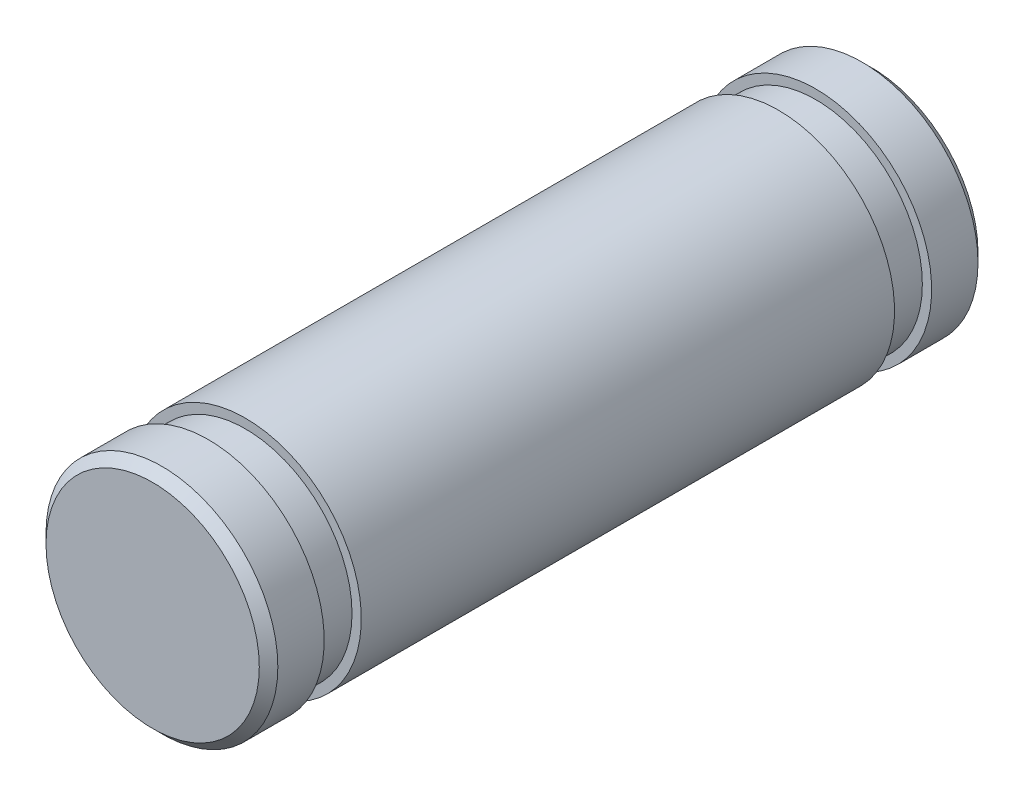
ISO-10303-21;
HEADER;
FILE_DESCRIPTION(('STEP AP214'),'2;1');
FILE_NAME('part.step','',(''),(''),'','','');
FILE_SCHEMA(('AUTOMOTIVE_DESIGN { 1 0 10303 214 1 1 1 1 }'));
ENDSEC;
DATA;
#1=APPLICATION_CONTEXT('core data for automotive mechanical design processes');
#2=APPLICATION_PROTOCOL_DEFINITION('international standard','automotive_design',2000,#1);
#3=PRODUCT_CONTEXT('',#1,'mechanical');
#4=PRODUCT('Part','Part','',(#3));
#5=PRODUCT_RELATED_PRODUCT_CATEGORY('part','',(#4));
#6=PRODUCT_DEFINITION_FORMATION('','',#4);
#7=PRODUCT_DEFINITION_CONTEXT('part definition',#1,'design');
#8=PRODUCT_DEFINITION('design','',#6,#7);
#9=PRODUCT_DEFINITION_SHAPE('','',#8);
#10=(LENGTH_UNIT() NAMED_UNIT(*) SI_UNIT(.MILLI.,.METRE.));
#11=(NAMED_UNIT(*) PLANE_ANGLE_UNIT() SI_UNIT($,.RADIAN.));
#12=(NAMED_UNIT(*) SI_UNIT($,.STERADIAN.) SOLID_ANGLE_UNIT());
#13=UNCERTAINTY_MEASURE_WITH_UNIT(LENGTH_MEASURE(1.E-05),#10,'distance_accuracy_value','');
#14=(GEOMETRIC_REPRESENTATION_CONTEXT(3) GLOBAL_UNCERTAINTY_ASSIGNED_CONTEXT((#13)) GLOBAL_UNIT_ASSIGNED_CONTEXT((#10,
#11,#12)) REPRESENTATION_CONTEXT('',''));
#15=CARTESIAN_POINT('',(0.,0.,0.));
#16=DIRECTION('',(0.,0.,1.));
#17=DIRECTION('',(1.,0.,0.));
#18=AXIS2_PLACEMENT_3D('',#15,#16,#17);
#19=CARTESIAN_POINT('',(0.,0.,13.5));
#20=DIRECTION('',(0.,0.,1.));
#21=DIRECTION('',(1.,0.,0.));
#22=AXIS2_PLACEMENT_3D('',#19,#20,#21);
#23=PLANE('',#22);
#24=CARTESIAN_POINT('',(0.,0.,13.5));
#25=DIRECTION('',(0.,0.,-1.));
#26=DIRECTION('',(-1.,0.,0.));
#27=AXIS2_PLACEMENT_3D('',#24,#25,#26);
#28=CIRCLE('',#27,2.3);
#29=CARTESIAN_POINT('',(2.3,0.,13.5));
#30=VERTEX_POINT('',#29);
#31=EDGE_CURVE('E145',#30,#30,#28,.T.);
#32=ORIENTED_EDGE('',*,*,#31,.T.);
#33=EDGE_LOOP('',(#32));
#34=FACE_BOUND('',#33,.T.);
#35=CARTESIAN_POINT('',(0.,0.,13.5));
#36=DIRECTION('',(0.,0.,-1.));
#37=DIRECTION('',(1.,0.,0.));
#38=AXIS2_PLACEMENT_3D('',#35,#36,#37);
#39=CIRCLE('',#38,2.5);
#40=CARTESIAN_POINT('',(-2.5,0.,13.5));
#41=VERTEX_POINT('',#40);
#42=EDGE_CURVE('E141',#41,#41,#39,.T.);
#43=ORIENTED_EDGE('',*,*,#42,.F.);
#44=EDGE_LOOP('',(#43));
#45=FACE_BOUND('',#44,.T.);
#46=ADVANCED_FACE('F17',(#34,#45),#23,.T.);
#47=CARTESIAN_POINT('',(0.,0.,14.3));
#48=DIRECTION('',(0.,0.,1.));
#49=DIRECTION('',(1.,0.,0.));
#50=AXIS2_PLACEMENT_3D('',#47,#48,#49);
#51=PLANE('',#50);
#52=CARTESIAN_POINT('',(0.,0.,14.3));
#53=DIRECTION('',(0.,0.,-1.));
#54=DIRECTION('',(-1.,0.,0.));
#55=AXIS2_PLACEMENT_3D('',#52,#53,#54);
#56=CIRCLE('',#55,2.3);
#57=CARTESIAN_POINT('',(2.3,0.,14.3));
#58=VERTEX_POINT('',#57);
#59=EDGE_CURVE('E11',#58,#58,#56,.T.);
#60=ORIENTED_EDGE('',*,*,#59,.F.);
#61=EDGE_LOOP('',(#60));
#62=FACE_BOUND('',#61,.T.);
#63=CARTESIAN_POINT('',(0.,0.,14.3));
#64=DIRECTION('',(0.,0.,1.));
#65=DIRECTION('',(1.,0.,0.));
#66=AXIS2_PLACEMENT_3D('',#63,#64,#65);
#67=CIRCLE('',#66,2.5);
#68=CARTESIAN_POINT('',(-2.5,0.,14.3));
#69=VERTEX_POINT('',#68);
#70=EDGE_CURVE('E130',#69,#69,#67,.T.);
#71=ORIENTED_EDGE('',*,*,#70,.F.);
#72=EDGE_LOOP('',(#71));
#73=FACE_BOUND('',#72,.T.);
#74=ADVANCED_FACE('F190',(#62,#73),#51,.F.);
#75=CARTESIAN_POINT('',(0.,0.,13.5));
#76=DIRECTION('',(0.,0.,1.));
#77=DIRECTION('',(-1.,0.,0.));
#78=AXIS2_PLACEMENT_3D('',#75,#76,#77);
#79=CYLINDRICAL_SURFACE('',#78,2.3);
#80=ORIENTED_EDGE('',*,*,#31,.F.);
#81=DIRECTION('',(0.,0.,1.));
#82=VECTOR('',#81,1.);
#83=CARTESIAN_POINT('',(2.3,0.,13.5));
#84=LINE('',#83,#82);
#85=EDGE_CURVE('E26',#30,#58,#84,.T.);
#86=ORIENTED_EDGE('',*,*,#85,.T.);
#87=ORIENTED_EDGE('',*,*,#59,.T.);
#88=ORIENTED_EDGE('',*,*,#85,.F.);
#89=EDGE_LOOP('',(#80,#86,#87,#88));
#90=FACE_BOUND('',#89,.T.);
#91=ADVANCED_FACE('F195',(#90),#79,.T.);
#92=CARTESIAN_POINT('',(0.,0.,0.));
#93=DIRECTION('',(0.,0.,1.));
#94=DIRECTION('',(1.,0.,0.));
#95=AXIS2_PLACEMENT_3D('',#92,#93,#94);
#96=CYLINDRICAL_SURFACE('',#95,2.5);
#97=ORIENTED_EDGE('',*,*,#42,.T.);
#98=DIRECTION('',(0.,0.,-1.));
#99=VECTOR('',#98,1.);
#100=CARTESIAN_POINT('',(-2.5,0.,0.));
#101=LINE('',#100,#99);
#102=CARTESIAN_POINT('',(-2.5,0.,2.));
#103=VERTEX_POINT('',#102);
#104=EDGE_CURVE('E144',#41,#103,#101,.T.);
#105=ORIENTED_EDGE('',*,*,#104,.T.);
#106=CARTESIAN_POINT('',(0.,0.,2.));
#107=DIRECTION('',(0.,0.,1.));
#108=DIRECTION('',(1.,0.,0.));
#109=AXIS2_PLACEMENT_3D('',#106,#107,#108);
#110=CIRCLE('',#109,2.5);
#111=EDGE_CURVE('E137',#103,#103,#110,.T.);
#112=ORIENTED_EDGE('',*,*,#111,.T.);
#113=ORIENTED_EDGE('',*,*,#104,.F.);
#114=EDGE_LOOP('',(#97,#105,#112,#113));
#115=FACE_BOUND('',#114,.T.);
#116=ADVANCED_FACE('F200',(#115),#96,.T.);
#117=CARTESIAN_POINT('',(0.,0.,2.));
#118=DIRECTION('',(0.,0.,-1.));
#119=DIRECTION('',(0.,-1.,0.));
#120=AXIS2_PLACEMENT_3D('',#117,#118,#119);
#121=PLANE('',#120);
#122=CARTESIAN_POINT('',(0.,0.,2.));
#123=DIRECTION('',(0.,0.,1.));
#124=DIRECTION('',(1.,0.,0.));
#125=AXIS2_PLACEMENT_3D('',#122,#123,#124);
#126=CIRCLE('',#125,2.3);
#127=CARTESIAN_POINT('',(-2.3,0.,2.));
#128=VERTEX_POINT('',#127);
#129=EDGE_CURVE('E125',#128,#128,#126,.T.);
#130=ORIENTED_EDGE('',*,*,#129,.T.);
#131=EDGE_LOOP('',(#130));
#132=FACE_BOUND('',#131,.T.);
#133=ORIENTED_EDGE('',*,*,#111,.F.);
#134=EDGE_LOOP('',(#133));
#135=FACE_BOUND('',#134,.T.);
#136=ADVANCED_FACE('F203',(#132,#135),#121,.T.);
#137=CARTESIAN_POINT('',(0.,0.,1.2));
#138=DIRECTION('',(0.,0.,-1.));
#139=DIRECTION('',(0.,-1.,0.));
#140=AXIS2_PLACEMENT_3D('',#137,#138,#139);
#141=PLANE('',#140);
#142=CARTESIAN_POINT('',(0.,0.,1.2));
#143=DIRECTION('',(0.,0.,1.));
#144=DIRECTION('',(1.,0.,0.));
#145=AXIS2_PLACEMENT_3D('',#142,#143,#144);
#146=CIRCLE('',#145,2.3);
#147=CARTESIAN_POINT('',(-2.3,0.,1.2));
#148=VERTEX_POINT('',#147);
#149=EDGE_CURVE('E134',#148,#148,#146,.T.);
#150=ORIENTED_EDGE('',*,*,#149,.F.);
#151=EDGE_LOOP('',(#150));
#152=FACE_BOUND('',#151,.T.);
#153=CARTESIAN_POINT('',(0.,0.,1.2));
#154=DIRECTION('',(0.,0.,-1.));
#155=DIRECTION('',(1.,0.,0.));
#156=AXIS2_PLACEMENT_3D('',#153,#154,#155);
#157=CIRCLE('',#156,2.5);
#158=CARTESIAN_POINT('',(-2.5,0.,1.2));
#159=VERTEX_POINT('',#158);
#160=EDGE_CURVE('E95',#159,#159,#157,.T.);
#161=ORIENTED_EDGE('',*,*,#160,.F.);
#162=EDGE_LOOP('',(#161));
#163=FACE_BOUND('',#162,.T.);
#164=ADVANCED_FACE('F186',(#152,#163),#141,.F.);
#165=CARTESIAN_POINT('',(0.,0.,2.));
#166=DIRECTION('',(0.,0.,-1.));
#167=DIRECTION('',(1.,0.,0.));
#168=AXIS2_PLACEMENT_3D('',#165,#166,#167);
#169=CYLINDRICAL_SURFACE('',#168,2.3);
#170=ORIENTED_EDGE('',*,*,#129,.F.);
#171=DIRECTION('',(0.,0.,-1.));
#172=VECTOR('',#171,1.);
#173=CARTESIAN_POINT('',(-2.3,0.,2.));
#174=LINE('',#173,#172);
#175=EDGE_CURVE('E129',#128,#148,#174,.T.);
#176=ORIENTED_EDGE('',*,*,#175,.T.);
#177=ORIENTED_EDGE('',*,*,#149,.T.);
#178=ORIENTED_EDGE('',*,*,#175,.F.);
#179=EDGE_LOOP('',(#170,#176,#177,#178));
#180=FACE_BOUND('',#179,.T.);
#181=ADVANCED_FACE('F176',(#180),#169,.T.);
#182=CARTESIAN_POINT('',(0.,0.,15.5));
#183=DIRECTION('',(0.,0.,1.));
#184=DIRECTION('',(1.,0.,0.));
#185=AXIS2_PLACEMENT_3D('',#182,#183,#184);
#186=PLANE('',#185);
#187=CARTESIAN_POINT('',(0.,0.,15.5));
#188=DIRECTION('',(0.,0.,-1.));
#189=DIRECTION('',(-1.,0.,0.));
#190=AXIS2_PLACEMENT_3D('',#187,#188,#189);
#191=CIRCLE('',#190,2.3);
#192=CARTESIAN_POINT('',(2.3,0.,15.5));
#193=VERTEX_POINT('',#192);
#194=EDGE_CURVE('E113',#193,#193,#191,.T.);
#195=ORIENTED_EDGE('',*,*,#194,.F.);
#196=EDGE_LOOP('',(#195));
#197=FACE_BOUND('',#196,.T.);
#198=ADVANCED_FACE('F173',(#197),#186,.T.);
#199=CARTESIAN_POINT('',(0.,0.,0.));
#200=DIRECTION('',(0.,0.,1.));
#201=DIRECTION('',(1.,0.,0.));
#202=AXIS2_PLACEMENT_3D('',#199,#200,#201);
#203=CYLINDRICAL_SURFACE('',#202,2.5);
#204=CARTESIAN_POINT('',(0.,0.,15.3));
#205=DIRECTION('',(0.,0.,1.));
#206=DIRECTION('',(-1.,0.,0.));
#207=AXIS2_PLACEMENT_3D('',#204,#205,#206);
#208=CIRCLE('',#207,2.5);
#209=CARTESIAN_POINT('',(2.5,0.,15.3));
#210=VERTEX_POINT('',#209);
#211=CARTESIAN_POINT('',(-2.5,0.,15.3));
#212=VERTEX_POINT('',#211);
#213=EDGE_CURVE('E117',#210,#212,#208,.T.);
#214=ORIENTED_EDGE('',*,*,#213,.F.);
#215=CARTESIAN_POINT('',(0.,0.,15.3));
#216=DIRECTION('',(0.,0.,1.));
#217=DIRECTION('',(-1.,0.,0.));
#218=AXIS2_PLACEMENT_3D('',#215,#216,#217);
#219=CIRCLE('',#218,2.5);
#220=EDGE_CURVE('E114',#212,#210,#219,.T.);
#221=ORIENTED_EDGE('',*,*,#220,.F.);
#222=DIRECTION('',(0.,0.,-1.));
#223=VECTOR('',#222,1.);
#224=CARTESIAN_POINT('',(-2.5,0.,0.));
#225=LINE('',#224,#223);
#226=EDGE_CURVE('E108',#212,#69,#225,.T.);
#227=ORIENTED_EDGE('',*,*,#226,.T.);
#228=ORIENTED_EDGE('',*,*,#70,.T.);
#229=ORIENTED_EDGE('',*,*,#226,.F.);
#230=EDGE_LOOP('',(#214,#221,#227,#228,#229));
#231=FACE_BOUND('',#230,.T.);
#232=ADVANCED_FACE('F175',(#231),#203,.T.);
#233=CARTESIAN_POINT('',(0.,0.,15.4));
#234=DIRECTION('',(0.,0.,-1.));
#235=DIRECTION('',(-1.,0.,0.));
#236=AXIS2_PLACEMENT_3D('',#233,#234,#235);
#237=CONICAL_SURFACE('',#236,2.4,0.785398163397448);
#238=ORIENTED_EDGE('',*,*,#194,.T.);
#239=DIRECTION('',(0.707106781186548,0.,-0.707106781186548));
#240=VECTOR('',#239,1.);
#241=CARTESIAN_POINT('',(2.4,0.,15.4));
#242=LINE('',#241,#240);
#243=EDGE_CURVE('E118',#193,#210,#242,.T.);
#244=ORIENTED_EDGE('',*,*,#243,.T.);
#245=ORIENTED_EDGE('',*,*,#213,.T.);
#246=ORIENTED_EDGE('',*,*,#220,.T.);
#247=ORIENTED_EDGE('',*,*,#243,.F.);
#248=EDGE_LOOP('',(#238,#244,#245,#246,#247));
#249=FACE_BOUND('',#248,.T.);
#250=ADVANCED_FACE('F171',(#249),#237,.T.);
#251=CARTESIAN_POINT('',(0.,0.,0.));
#252=DIRECTION('',(0.,0.,1.));
#253=DIRECTION('',(1.,0.,0.));
#254=AXIS2_PLACEMENT_3D('',#251,#252,#253);
#255=PLANE('',#254);
#256=CARTESIAN_POINT('',(0.,0.,0.));
#257=DIRECTION('',(0.,0.,1.));
#258=DIRECTION('',(-1.,0.,0.));
#259=AXIS2_PLACEMENT_3D('',#256,#257,#258);
#260=CIRCLE('',#259,2.3);
#261=CARTESIAN_POINT('',(2.3,0.,0.));
#262=VERTEX_POINT('',#261);
#263=EDGE_CURVE('E88',#262,#262,#260,.T.);
#264=ORIENTED_EDGE('',*,*,#263,.F.);
#265=EDGE_LOOP('',(#264));
#266=FACE_BOUND('',#265,.T.);
#267=ADVANCED_FACE('F223',(#266),#255,.F.);
#268=CARTESIAN_POINT('',(0.,0.,0.));
#269=DIRECTION('',(0.,0.,1.));
#270=DIRECTION('',(1.,0.,0.));
#271=AXIS2_PLACEMENT_3D('',#268,#269,#270);
#272=CYLINDRICAL_SURFACE('',#271,2.5);
#273=ORIENTED_EDGE('',*,*,#160,.T.);
#274=DIRECTION('',(0.,0.,-1.));
#275=VECTOR('',#274,1.);
#276=CARTESIAN_POINT('',(-2.5,0.,0.));
#277=LINE('',#276,#275);
#278=CARTESIAN_POINT('',(-2.5,0.,0.2));
#279=VERTEX_POINT('',#278);
#280=EDGE_CURVE('E103',#159,#279,#277,.T.);
#281=ORIENTED_EDGE('',*,*,#280,.T.);
#282=CARTESIAN_POINT('',(0.,0.,0.2));
#283=DIRECTION('',(0.,0.,-1.));
#284=DIRECTION('',(-1.,0.,0.));
#285=AXIS2_PLACEMENT_3D('',#282,#283,#284);
#286=CIRCLE('',#285,2.5);
#287=CARTESIAN_POINT('',(2.5,0.,0.2));
#288=VERTEX_POINT('',#287);
#289=EDGE_CURVE('E161',#288,#279,#286,.T.);
#290=ORIENTED_EDGE('',*,*,#289,.F.);
#291=CARTESIAN_POINT('',(0.,0.,0.2));
#292=DIRECTION('',(0.,0.,-1.));
#293=DIRECTION('',(-1.,0.,0.));
#294=AXIS2_PLACEMENT_3D('',#291,#292,#293);
#295=CIRCLE('',#294,2.5);
#296=EDGE_CURVE('E105',#279,#288,#295,.T.);
#297=ORIENTED_EDGE('',*,*,#296,.F.);
#298=ORIENTED_EDGE('',*,*,#280,.F.);
#299=EDGE_LOOP('',(#273,#281,#290,#297,#298));
#300=FACE_BOUND('',#299,.T.);
#301=ADVANCED_FACE('F219',(#300),#272,.T.);
#302=CARTESIAN_POINT('',(0.,0.,0.1));
#303=DIRECTION('',(0.,0.,1.));
#304=DIRECTION('',(-1.,0.,0.));
#305=AXIS2_PLACEMENT_3D('',#302,#303,#304);
#306=CONICAL_SURFACE('',#305,2.4,0.785398163397449);
#307=ORIENTED_EDGE('',*,*,#289,.T.);
#308=ORIENTED_EDGE('',*,*,#296,.T.);
#309=DIRECTION('',(-0.707106781186548,0.,-0.707106781186547));
#310=VECTOR('',#309,1.);
#311=CARTESIAN_POINT('',(2.4,0.,0.1));
#312=LINE('',#311,#310);
#313=EDGE_CURVE('E91',#288,#262,#312,.T.);
#314=ORIENTED_EDGE('',*,*,#313,.T.);
#315=ORIENTED_EDGE('',*,*,#263,.T.);
#316=ORIENTED_EDGE('',*,*,#313,.F.);
#317=EDGE_LOOP('',(#307,#308,#314,#315,#316));
#318=FACE_BOUND('',#317,.T.);
#319=ADVANCED_FACE('F90',(#318),#306,.T.);
#320=CLOSED_SHELL('',(#46,#74,#91,#116,#136,#164,#181,#198,#232,#250,#267,#301,#319));
#321=MANIFOLD_SOLID_BREP('B1',#320);
#322=ADVANCED_BREP_SHAPE_REPRESENTATION('',(#18,#321),#14);
#323=SHAPE_DEFINITION_REPRESENTATION(#9,#322);
ENDSEC;
END-ISO-10303-21;
